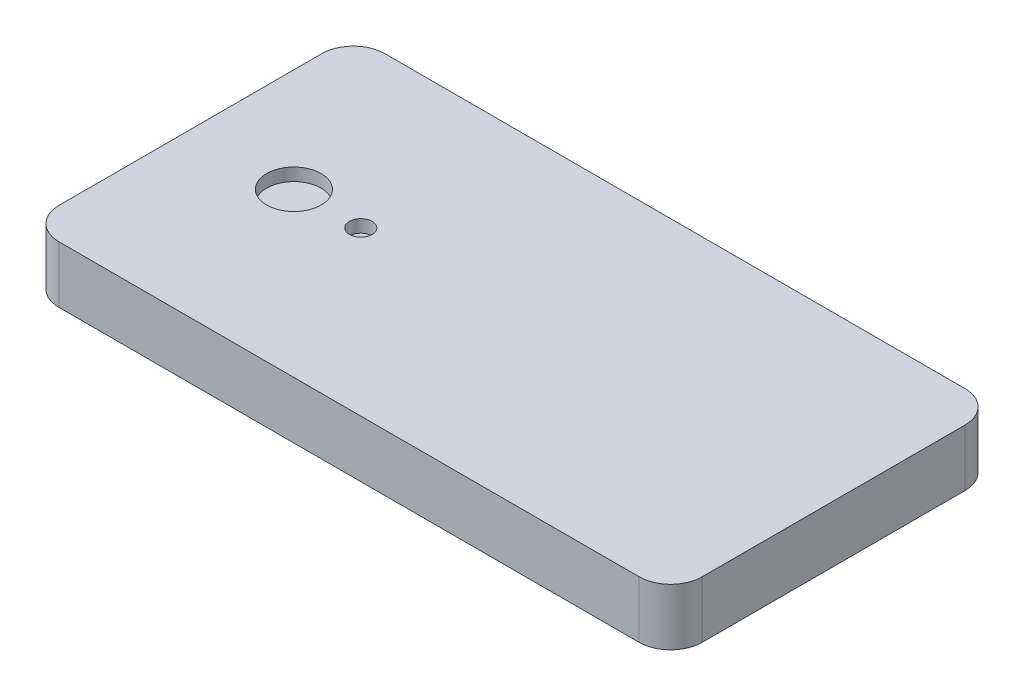
ISO-10303-21;
HEADER;
FILE_DESCRIPTION(('STEP AP214'),'2;1');
FILE_NAME('part.step','',(''),(''),'','','');
FILE_SCHEMA(('AUTOMOTIVE_DESIGN { 1 0 10303 214 1 1 1 1 }'));
ENDSEC;
DATA;
#1=APPLICATION_CONTEXT('core data for automotive mechanical design processes');
#2=APPLICATION_PROTOCOL_DEFINITION('international standard','automotive_design',2000,#1);
#3=PRODUCT_CONTEXT('',#1,'mechanical');
#4=PRODUCT('Part','Part','',(#3));
#5=PRODUCT_RELATED_PRODUCT_CATEGORY('part','',(#4));
#6=PRODUCT_DEFINITION_FORMATION('','',#4);
#7=PRODUCT_DEFINITION_CONTEXT('part definition',#1,'design');
#8=PRODUCT_DEFINITION('design','',#6,#7);
#9=PRODUCT_DEFINITION_SHAPE('','',#8);
#10=(LENGTH_UNIT() NAMED_UNIT(*) SI_UNIT(.MILLI.,.METRE.));
#11=(NAMED_UNIT(*) PLANE_ANGLE_UNIT() SI_UNIT($,.RADIAN.));
#12=(NAMED_UNIT(*) SI_UNIT($,.STERADIAN.) SOLID_ANGLE_UNIT());
#13=UNCERTAINTY_MEASURE_WITH_UNIT(LENGTH_MEASURE(1.E-05),#10,'distance_accuracy_value','');
#14=(GEOMETRIC_REPRESENTATION_CONTEXT(3) GLOBAL_UNCERTAINTY_ASSIGNED_CONTEXT((#13)) GLOBAL_UNIT_ASSIGNED_CONTEXT((#10,
#11,#12)) REPRESENTATION_CONTEXT('',''));
#15=CARTESIAN_POINT('',(0.,0.,0.));
#16=DIRECTION('',(0.,0.,1.));
#17=DIRECTION('',(1.,0.,0.));
#18=AXIS2_PLACEMENT_3D('',#15,#16,#17);
#19=CARTESIAN_POINT('',(-5.73490419928826,11.43,-2.72926163701068));
#20=DIRECTION('',(1.,0.,0.));
#21=DIRECTION('',(0.,0.,-1.));
#22=AXIS2_PLACEMENT_3D('',#19,#20,#21);
#23=PLANE('',#22);
#24=DIRECTION('',(0.,0.,1.));
#25=VECTOR('',#24,1.);
#26=CARTESIAN_POINT('',(-5.73490419928826,11.43,-2.72926163701068));
#27=LINE('',#26,#25);
#28=CARTESIAN_POINT('',(-5.73490419928826,11.43,3.62073836298932));
#29=VERTEX_POINT('',#28);
#30=CARTESIAN_POINT('',(-5.73490419928825,11.43,56.5035383629893));
#31=VERTEX_POINT('',#30);
#32=EDGE_CURVE('E152',#29,#31,#27,.T.);
#33=ORIENTED_EDGE('',*,*,#32,.F.);
#34=DIRECTION('',(0.,-1.,0.));
#35=VECTOR('',#34,1.);
#36=CARTESIAN_POINT('',(-5.73490419928826,0.,3.62073836298932));
#37=LINE('',#36,#35);
#38=CARTESIAN_POINT('',(-5.73490419928826,0.,3.62073836298932));
#39=VERTEX_POINT('',#38);
#40=EDGE_CURVE('E11',#29,#39,#37,.T.);
#41=ORIENTED_EDGE('',*,*,#40,.T.);
#42=DIRECTION('',(0.,0.,1.));
#43=VECTOR('',#42,1.);
#44=CARTESIAN_POINT('',(-5.73490419928826,0.,-2.72926163701068));
#45=LINE('',#44,#43);
#46=CARTESIAN_POINT('',(-5.73490419928825,0.,56.5035383629893));
#47=VERTEX_POINT('',#46);
#48=EDGE_CURVE('E155',#39,#47,#45,.T.);
#49=ORIENTED_EDGE('',*,*,#48,.T.);
#50=DIRECTION('',(0.,-1.,0.));
#51=VECTOR('',#50,1.);
#52=CARTESIAN_POINT('',(-5.73490419928825,11.43,56.5035383629893));
#53=LINE('',#52,#51);
#54=EDGE_CURVE('E41',#47,#31,#53,.F.);
#55=ORIENTED_EDGE('',*,*,#54,.T.);
#56=EDGE_LOOP('',(#33,#41,#49,#55));
#57=FACE_BOUND('',#56,.T.);
#58=ADVANCED_FACE('F33',(#57),#23,.F.);
#59=CARTESIAN_POINT('',(-5.73490419928825,11.43,62.8535383629893));
#60=DIRECTION('',(0.,0.,-1.));
#61=DIRECTION('',(-1.,0.,0.));
#62=AXIS2_PLACEMENT_3D('',#59,#60,#61);
#63=PLANE('',#62);
#64=DIRECTION('',(1.,0.,0.));
#65=VECTOR('',#64,1.);
#66=CARTESIAN_POINT('',(-5.73490419928825,0.,62.8535383629893));
#67=LINE('',#66,#65);
#68=CARTESIAN_POINT('',(0.61509580071175,0.,62.8535383629893));
#69=VERTEX_POINT('',#68);
#70=CARTESIAN_POINT('',(117.353495800712,0.,62.8535383629893));
#71=VERTEX_POINT('',#70);
#72=EDGE_CURVE('E119',#69,#71,#67,.T.);
#73=ORIENTED_EDGE('',*,*,#72,.T.);
#74=DIRECTION('',(0.,-1.,0.));
#75=VECTOR('',#74,1.);
#76=CARTESIAN_POINT('',(117.353495800712,11.43,62.8535383629893));
#77=LINE('',#76,#75);
#78=CARTESIAN_POINT('',(117.353495800712,11.43,62.8535383629893));
#79=VERTEX_POINT('',#78);
#80=EDGE_CURVE('E136',#71,#79,#77,.F.);
#81=ORIENTED_EDGE('',*,*,#80,.T.);
#82=DIRECTION('',(1.,0.,0.));
#83=VECTOR('',#82,1.);
#84=CARTESIAN_POINT('',(-5.73490419928825,11.43,62.8535383629893));
#85=LINE('',#84,#83);
#86=CARTESIAN_POINT('',(0.61509580071175,11.43,62.8535383629893));
#87=VERTEX_POINT('',#86);
#88=EDGE_CURVE('E162',#87,#79,#85,.T.);
#89=ORIENTED_EDGE('',*,*,#88,.F.);
#90=DIRECTION('',(0.,-1.,0.));
#91=VECTOR('',#90,1.);
#92=CARTESIAN_POINT('',(0.61509580071175,11.43,62.8535383629893));
#93=LINE('',#92,#91);
#94=EDGE_CURVE('E133',#87,#69,#93,.T.);
#95=ORIENTED_EDGE('',*,*,#94,.T.);
#96=EDGE_LOOP('',(#73,#81,#89,#95));
#97=FACE_BOUND('',#96,.T.);
#98=ADVANCED_FACE('F168',(#97),#63,.F.);
#99=CARTESIAN_POINT('',(123.703495800712,11.43,-2.72926163701068));
#100=DIRECTION('',(1.,0.,0.));
#101=DIRECTION('',(0.,0.,-1.));
#102=AXIS2_PLACEMENT_3D('',#99,#100,#101);
#103=PLANE('',#102);
#104=DIRECTION('',(0.,0.,1.));
#105=VECTOR('',#104,1.);
#106=CARTESIAN_POINT('',(123.703495800712,11.43,-2.72926163701068));
#107=LINE('',#106,#105);
#108=CARTESIAN_POINT('',(123.703495800712,11.43,3.62073836298932));
#109=VERTEX_POINT('',#108);
#110=CARTESIAN_POINT('',(123.703495800712,11.43,56.5035383629893));
#111=VERTEX_POINT('',#110);
#112=EDGE_CURVE('E126',#109,#111,#107,.T.);
#113=ORIENTED_EDGE('',*,*,#112,.T.);
#114=DIRECTION('',(0.,-1.,0.));
#115=VECTOR('',#114,1.);
#116=CARTESIAN_POINT('',(123.703495800712,0.,56.5035383629893));
#117=LINE('',#116,#115);
#118=CARTESIAN_POINT('',(123.703495800712,0.,56.5035383629893));
#119=VERTEX_POINT('',#118);
#120=EDGE_CURVE('E118',#111,#119,#117,.T.);
#121=ORIENTED_EDGE('',*,*,#120,.T.);
#122=DIRECTION('',(0.,0.,1.));
#123=VECTOR('',#122,1.);
#124=CARTESIAN_POINT('',(123.703495800712,0.,-2.72926163701068));
#125=LINE('',#124,#123);
#126=CARTESIAN_POINT('',(123.703495800712,0.,3.62073836298932));
#127=VERTEX_POINT('',#126);
#128=EDGE_CURVE('E103',#127,#119,#125,.T.);
#129=ORIENTED_EDGE('',*,*,#128,.F.);
#130=DIRECTION('',(0.,-1.,0.));
#131=VECTOR('',#130,1.);
#132=CARTESIAN_POINT('',(123.703495800712,11.43,3.62073836298932));
#133=LINE('',#132,#131);
#134=EDGE_CURVE('E116',#127,#109,#133,.F.);
#135=ORIENTED_EDGE('',*,*,#134,.T.);
#136=EDGE_LOOP('',(#113,#121,#129,#135));
#137=FACE_BOUND('',#136,.T.);
#138=ADVANCED_FACE('F115',(#137),#103,.T.);
#139=CARTESIAN_POINT('',(-5.73490419928826,11.43,-2.72926163701068));
#140=DIRECTION('',(0.,0.,-1.));
#141=DIRECTION('',(-1.,0.,0.));
#142=AXIS2_PLACEMENT_3D('',#139,#140,#141);
#143=PLANE('',#142);
#144=DIRECTION('',(1.,0.,0.));
#145=VECTOR('',#144,1.);
#146=CARTESIAN_POINT('',(-5.73490419928826,11.43,-2.72926163701068));
#147=LINE('',#146,#145);
#148=CARTESIAN_POINT('',(0.615095800711745,11.43,-2.72926163701068));
#149=VERTEX_POINT('',#148);
#150=CARTESIAN_POINT('',(117.353495800712,11.43,-2.72926163701068));
#151=VERTEX_POINT('',#150);
#152=EDGE_CURVE('E122',#149,#151,#147,.T.);
#153=ORIENTED_EDGE('',*,*,#152,.T.);
#154=DIRECTION('',(0.,-1.,0.));
#155=VECTOR('',#154,1.);
#156=CARTESIAN_POINT('',(117.353495800712,11.43,-2.72926163701068));
#157=LINE('',#156,#155);
#158=CARTESIAN_POINT('',(117.353495800712,0.,-2.72926163701068));
#159=VERTEX_POINT('',#158);
#160=EDGE_CURVE('E146',#151,#159,#157,.T.);
#161=ORIENTED_EDGE('',*,*,#160,.T.);
#162=DIRECTION('',(1.,0.,0.));
#163=VECTOR('',#162,1.);
#164=CARTESIAN_POINT('',(-5.73490419928826,0.,-2.72926163701068));
#165=LINE('',#164,#163);
#166=CARTESIAN_POINT('',(0.615095800711745,0.,-2.72926163701068));
#167=VERTEX_POINT('',#166);
#168=EDGE_CURVE('E104',#167,#159,#165,.T.);
#169=ORIENTED_EDGE('',*,*,#168,.F.);
#170=DIRECTION('',(0.,-1.,0.));
#171=VECTOR('',#170,1.);
#172=CARTESIAN_POINT('',(0.615095800711745,11.43,-2.72926163701068));
#173=LINE('',#172,#171);
#174=EDGE_CURVE('E55',#167,#149,#173,.F.);
#175=ORIENTED_EDGE('',*,*,#174,.T.);
#176=EDGE_LOOP('',(#153,#161,#169,#175));
#177=FACE_BOUND('',#176,.T.);
#178=ADVANCED_FACE('F199',(#177),#143,.T.);
#179=CARTESIAN_POINT('',(0.,11.43,0.));
#180=DIRECTION('',(0.,1.,0.));
#181=DIRECTION('',(0.,0.,1.));
#182=AXIS2_PLACEMENT_3D('',#179,#180,#181);
#183=PLANE('',#182);
#184=CARTESIAN_POINT('',(28.5550958007118,11.43,30.0621383629893));
#185=DIRECTION('',(0.,1.,0.));
#186=DIRECTION('',(0.,0.,1.));
#187=AXIS2_PLACEMENT_3D('',#184,#185,#186);
#188=CIRCLE('',#187,2.286);
#189=CARTESIAN_POINT('',(28.5550958007118,11.43,32.3481383629893));
#190=VERTEX_POINT('',#189);
#191=EDGE_CURVE('E182',#190,#190,#188,.T.);
#192=ORIENTED_EDGE('',*,*,#191,.F.);
#193=EDGE_LOOP('',(#192));
#194=FACE_BOUND('',#193,.T.);
#195=CARTESIAN_POINT('',(15.0930958007117,11.43,30.0621383629893));
#196=DIRECTION('',(0.,1.,0.));
#197=DIRECTION('',(0.,0.,1.));
#198=AXIS2_PLACEMENT_3D('',#195,#196,#197);
#199=CIRCLE('',#198,5.4864);
#200=CARTESIAN_POINT('',(15.0930958007117,11.43,35.5485383629893));
#201=VERTEX_POINT('',#200);
#202=EDGE_CURVE('E176',#201,#201,#199,.T.);
#203=ORIENTED_EDGE('',*,*,#202,.F.);
#204=EDGE_LOOP('',(#203));
#205=FACE_BOUND('',#204,.T.);
#206=ORIENTED_EDGE('',*,*,#88,.T.);
#207=CARTESIAN_POINT('',(117.353495800712,11.43,56.5035383629893));
#208=DIRECTION('',(0.,1.,0.));
#209=DIRECTION('',(0.,0.,1.));
#210=AXIS2_PLACEMENT_3D('',#207,#208,#209);
#211=CIRCLE('',#210,6.35);
#212=EDGE_CURVE('E143',#79,#111,#211,.T.);
#213=ORIENTED_EDGE('',*,*,#212,.T.);
#214=ORIENTED_EDGE('',*,*,#112,.F.);
#215=CARTESIAN_POINT('',(117.353495800712,11.43,3.62073836298932));
#216=DIRECTION('',(0.,1.,0.));
#217=DIRECTION('',(0.,0.,1.));
#218=AXIS2_PLACEMENT_3D('',#215,#216,#217);
#219=CIRCLE('',#218,6.35);
#220=EDGE_CURVE('E48',#109,#151,#219,.T.);
#221=ORIENTED_EDGE('',*,*,#220,.T.);
#222=ORIENTED_EDGE('',*,*,#152,.F.);
#223=CARTESIAN_POINT('',(0.615095800711745,11.43,3.62073836298932));
#224=DIRECTION('',(0.,1.,0.));
#225=DIRECTION('',(0.,0.,1.));
#226=AXIS2_PLACEMENT_3D('',#223,#224,#225);
#227=CIRCLE('',#226,6.35);
#228=EDGE_CURVE('E140',#149,#29,#227,.T.);
#229=ORIENTED_EDGE('',*,*,#228,.T.);
#230=ORIENTED_EDGE('',*,*,#32,.T.);
#231=CARTESIAN_POINT('',(0.61509580071175,11.43,56.5035383629893));
#232=DIRECTION('',(0.,1.,0.));
#233=DIRECTION('',(0.,0.,1.));
#234=AXIS2_PLACEMENT_3D('',#231,#232,#233);
#235=CIRCLE('',#234,6.35);
#236=EDGE_CURVE('E138',#31,#87,#235,.T.);
#237=ORIENTED_EDGE('',*,*,#236,.T.);
#238=EDGE_LOOP('',(#206,#213,#214,#221,#222,#229,#230,#237));
#239=FACE_BOUND('',#238,.T.);
#240=ADVANCED_FACE('F159',(#194,#205,#239),#183,.T.);
#241=CARTESIAN_POINT('',(0.,0.,0.));
#242=DIRECTION('',(0.,1.,0.));
#243=DIRECTION('',(0.,0.,1.));
#244=AXIS2_PLACEMENT_3D('',#241,#242,#243);
#245=PLANE('',#244);
#246=ORIENTED_EDGE('',*,*,#128,.T.);
#247=CARTESIAN_POINT('',(117.353495800712,0.,56.5035383629893));
#248=DIRECTION('',(0.,1.,0.));
#249=DIRECTION('',(0.,0.,1.));
#250=AXIS2_PLACEMENT_3D('',#247,#248,#249);
#251=CIRCLE('',#250,6.35);
#252=EDGE_CURVE('E109',#119,#71,#251,.F.);
#253=ORIENTED_EDGE('',*,*,#252,.T.);
#254=ORIENTED_EDGE('',*,*,#72,.F.);
#255=CARTESIAN_POINT('',(0.61509580071175,0.,56.5035383629893));
#256=DIRECTION('',(0.,1.,0.));
#257=DIRECTION('',(0.,0.,1.));
#258=AXIS2_PLACEMENT_3D('',#255,#256,#257);
#259=CIRCLE('',#258,6.35);
#260=EDGE_CURVE('E124',#69,#47,#259,.F.);
#261=ORIENTED_EDGE('',*,*,#260,.T.);
#262=ORIENTED_EDGE('',*,*,#48,.F.);
#263=CARTESIAN_POINT('',(0.615095800711745,0.,3.62073836298932));
#264=DIRECTION('',(0.,1.,0.));
#265=DIRECTION('',(0.,0.,1.));
#266=AXIS2_PLACEMENT_3D('',#263,#264,#265);
#267=CIRCLE('',#266,6.35);
#268=EDGE_CURVE('E110',#39,#167,#267,.F.);
#269=ORIENTED_EDGE('',*,*,#268,.T.);
#270=ORIENTED_EDGE('',*,*,#168,.T.);
#271=CARTESIAN_POINT('',(117.353495800712,0.,3.62073836298932));
#272=DIRECTION('',(0.,1.,0.));
#273=DIRECTION('',(0.,0.,1.));
#274=AXIS2_PLACEMENT_3D('',#271,#272,#273);
#275=CIRCLE('',#274,6.35);
#276=EDGE_CURVE('E100',#159,#127,#275,.F.);
#277=ORIENTED_EDGE('',*,*,#276,.T.);
#278=EDGE_LOOP('',(#246,#253,#254,#261,#262,#269,#270,#277));
#279=FACE_BOUND('',#278,.T.);
#280=ADVANCED_FACE('F102',(#279),#245,.F.);
#281=CARTESIAN_POINT('',(117.353495800712,11.43,56.5035383629893));
#282=DIRECTION('',(0.,1.,0.));
#283=DIRECTION('',(0.,0.,1.));
#284=AXIS2_PLACEMENT_3D('',#281,#282,#283);
#285=CYLINDRICAL_SURFACE('',#284,6.35);
#286=ORIENTED_EDGE('',*,*,#212,.F.);
#287=ORIENTED_EDGE('',*,*,#80,.F.);
#288=ORIENTED_EDGE('',*,*,#252,.F.);
#289=ORIENTED_EDGE('',*,*,#120,.F.);
#290=EDGE_LOOP('',(#286,#287,#288,#289));
#291=FACE_BOUND('',#290,.T.);
#292=ADVANCED_FACE('F223',(#291),#285,.T.);
#293=CARTESIAN_POINT('',(117.353495800712,11.43,3.62073836298932));
#294=DIRECTION('',(0.,-1.,0.));
#295=DIRECTION('',(0.,0.,-1.));
#296=AXIS2_PLACEMENT_3D('',#293,#294,#295);
#297=CYLINDRICAL_SURFACE('',#296,6.35);
#298=ORIENTED_EDGE('',*,*,#220,.F.);
#299=ORIENTED_EDGE('',*,*,#134,.F.);
#300=ORIENTED_EDGE('',*,*,#276,.F.);
#301=ORIENTED_EDGE('',*,*,#160,.F.);
#302=EDGE_LOOP('',(#298,#299,#300,#301));
#303=FACE_BOUND('',#302,.T.);
#304=ADVANCED_FACE('F121',(#303),#297,.T.);
#305=CARTESIAN_POINT('',(0.615095800711745,11.43,3.62073836298932));
#306=DIRECTION('',(0.,1.,0.));
#307=DIRECTION('',(0.,0.,1.));
#308=AXIS2_PLACEMENT_3D('',#305,#306,#307);
#309=CYLINDRICAL_SURFACE('',#308,6.35);
#310=ORIENTED_EDGE('',*,*,#228,.F.);
#311=ORIENTED_EDGE('',*,*,#174,.F.);
#312=ORIENTED_EDGE('',*,*,#268,.F.);
#313=ORIENTED_EDGE('',*,*,#40,.F.);
#314=EDGE_LOOP('',(#310,#311,#312,#313));
#315=FACE_BOUND('',#314,.T.);
#316=ADVANCED_FACE('F213',(#315),#309,.T.);
#317=CARTESIAN_POINT('',(0.61509580071175,11.43,56.5035383629893));
#318=DIRECTION('',(0.,-1.,0.));
#319=DIRECTION('',(0.,0.,-1.));
#320=AXIS2_PLACEMENT_3D('',#317,#318,#319);
#321=CYLINDRICAL_SURFACE('',#320,6.35);
#322=ORIENTED_EDGE('',*,*,#236,.F.);
#323=ORIENTED_EDGE('',*,*,#54,.F.);
#324=ORIENTED_EDGE('',*,*,#260,.F.);
#325=ORIENTED_EDGE('',*,*,#94,.F.);
#326=EDGE_LOOP('',(#322,#323,#324,#325));
#327=FACE_BOUND('',#326,.T.);
#328=ADVANCED_FACE('F35',(#327),#321,.T.);
#329=CARTESIAN_POINT('',(15.0930958007117,8.89,30.0621383629893));
#330=DIRECTION('',(0.,1.,0.));
#331=DIRECTION('',(0.,0.,1.));
#332=AXIS2_PLACEMENT_3D('',#329,#330,#331);
#333=CYLINDRICAL_SURFACE('',#332,5.4864);
#334=CARTESIAN_POINT('',(15.0930958007117,8.89,30.0621383629893));
#335=DIRECTION('',(0.,1.,0.));
#336=DIRECTION('',(0.,0.,1.));
#337=AXIS2_PLACEMENT_3D('',#334,#335,#336);
#338=CIRCLE('',#337,5.4864);
#339=CARTESIAN_POINT('',(15.0930958007117,8.89,35.5485383629893));
#340=VERTEX_POINT('',#339);
#341=EDGE_CURVE('E171',#340,#340,#338,.T.);
#342=ORIENTED_EDGE('',*,*,#341,.F.);
#343=EDGE_LOOP('',(#342));
#344=FACE_BOUND('',#343,.T.);
#345=ORIENTED_EDGE('',*,*,#202,.T.);
#346=EDGE_LOOP('',(#345));
#347=FACE_BOUND('',#346,.T.);
#348=ADVANCED_FACE('F203',(#344,#347),#333,.F.);
#349=CARTESIAN_POINT('',(15.0930958007117,8.89,30.0621383629893));
#350=DIRECTION('',(0.,1.,0.));
#351=DIRECTION('',(0.,0.,1.));
#352=AXIS2_PLACEMENT_3D('',#349,#350,#351);
#353=PLANE('',#352);
#354=ORIENTED_EDGE('',*,*,#341,.T.);
#355=EDGE_LOOP('',(#354));
#356=FACE_BOUND('',#355,.T.);
#357=ADVANCED_FACE('F193',(#356),#353,.T.);
#358=CARTESIAN_POINT('',(28.5550958007118,8.89,30.0621383629893));
#359=DIRECTION('',(0.,1.,0.));
#360=DIRECTION('',(0.,0.,1.));
#361=AXIS2_PLACEMENT_3D('',#358,#359,#360);
#362=CYLINDRICAL_SURFACE('',#361,2.286);
#363=CARTESIAN_POINT('',(28.5550958007118,8.89,30.0621383629893));
#364=DIRECTION('',(0.,1.,0.));
#365=DIRECTION('',(0.,0.,1.));
#366=AXIS2_PLACEMENT_3D('',#363,#364,#365);
#367=CIRCLE('',#366,2.286);
#368=CARTESIAN_POINT('',(28.5550958007118,8.89,32.3481383629893));
#369=VERTEX_POINT('',#368);
#370=EDGE_CURVE('E179',#369,#369,#367,.T.);
#371=ORIENTED_EDGE('',*,*,#370,.F.);
#372=EDGE_LOOP('',(#371));
#373=FACE_BOUND('',#372,.T.);
#374=ORIENTED_EDGE('',*,*,#191,.T.);
#375=EDGE_LOOP('',(#374));
#376=FACE_BOUND('',#375,.T.);
#377=ADVANCED_FACE('F190',(#373,#376),#362,.F.);
#378=CARTESIAN_POINT('',(28.5550958007118,8.89,30.0621383629893));
#379=DIRECTION('',(0.,1.,0.));
#380=DIRECTION('',(0.,0.,1.));
#381=AXIS2_PLACEMENT_3D('',#378,#379,#380);
#382=PLANE('',#381);
#383=ORIENTED_EDGE('',*,*,#370,.T.);
#384=EDGE_LOOP('',(#383));
#385=FACE_BOUND('',#384,.T.);
#386=ADVANCED_FACE('F188',(#385),#382,.T.);
#387=CLOSED_SHELL('',(#58,#98,#138,#178,#240,#280,#292,#304,#316,#328,#348,#357,#377,#386));
#388=MANIFOLD_SOLID_BREP('B2',#387);
#389=ADVANCED_BREP_SHAPE_REPRESENTATION('',(#18,#388),#14);
#390=SHAPE_DEFINITION_REPRESENTATION(#9,#389);
ENDSEC;
END-ISO-10303-21;
